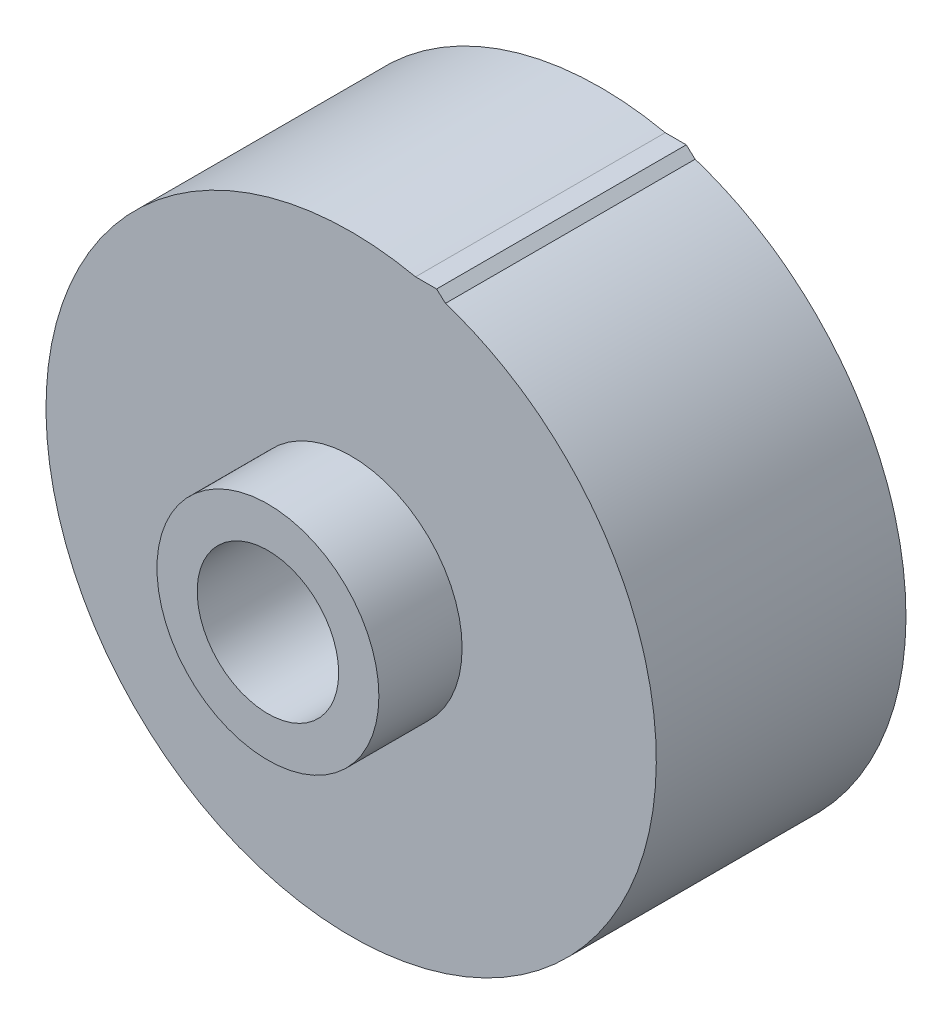
ISO-10303-21;
HEADER;
FILE_DESCRIPTION(('STEP AP214'),'2;1');
FILE_NAME('part.step','',(''),(''),'','','');
FILE_SCHEMA(('AUTOMOTIVE_DESIGN { 1 0 10303 214 1 1 1 1 }'));
ENDSEC;
DATA;
#1=APPLICATION_CONTEXT('core data for automotive mechanical design processes');
#2=APPLICATION_PROTOCOL_DEFINITION('international standard','automotive_design',2000,#1);
#3=PRODUCT_CONTEXT('',#1,'mechanical');
#4=PRODUCT('Part','Part','',(#3));
#5=PRODUCT_RELATED_PRODUCT_CATEGORY('part','',(#4));
#6=PRODUCT_DEFINITION_FORMATION('','',#4);
#7=PRODUCT_DEFINITION_CONTEXT('part definition',#1,'design');
#8=PRODUCT_DEFINITION('design','',#6,#7);
#9=PRODUCT_DEFINITION_SHAPE('','',#8);
#10=(LENGTH_UNIT() NAMED_UNIT(*) SI_UNIT(.MILLI.,.METRE.));
#11=(NAMED_UNIT(*) PLANE_ANGLE_UNIT() SI_UNIT($,.RADIAN.));
#12=(NAMED_UNIT(*) SI_UNIT($,.STERADIAN.) SOLID_ANGLE_UNIT());
#13=UNCERTAINTY_MEASURE_WITH_UNIT(LENGTH_MEASURE(1.E-05),#10,'distance_accuracy_value','');
#14=(GEOMETRIC_REPRESENTATION_CONTEXT(3) GLOBAL_UNCERTAINTY_ASSIGNED_CONTEXT((#13)) GLOBAL_UNIT_ASSIGNED_CONTEXT((#10,
#11,#12)) REPRESENTATION_CONTEXT('',''));
#15=CARTESIAN_POINT('',(0.,0.,0.));
#16=DIRECTION('',(0.,0.,1.));
#17=DIRECTION('',(1.,0.,0.));
#18=AXIS2_PLACEMENT_3D('',#15,#16,#17);
#19=CARTESIAN_POINT('',(0.,0.,18.));
#20=DIRECTION('',(0.,0.,-1.));
#21=DIRECTION('',(-1.,0.,0.));
#22=AXIS2_PLACEMENT_3D('',#19,#20,#21);
#23=CYLINDRICAL_SURFACE('',#22,22.);
#24=CARTESIAN_POINT('',(0.,0.,0.));
#25=DIRECTION('',(0.,0.,1.));
#26=DIRECTION('',(1.,0.,0.));
#27=AXIS2_PLACEMENT_3D('',#24,#25,#26);
#28=CIRCLE('',#27,22.);
#29=CARTESIAN_POINT('',(12.1073705117591,18.3687664063482,0.));
#30=VERTEX_POINT('',#29);
#31=CARTESIAN_POINT('',(7.74411035758695,20.5919584976639,0.));
#32=VERTEX_POINT('',#31);
#33=EDGE_CURVE('E246',#30,#32,#28,.T.);
#34=ORIENTED_EDGE('',*,*,#33,.T.);
#35=CARTESIAN_POINT('',(0.,0.,0.));
#36=DIRECTION('',(0.,0.,1.));
#37=DIRECTION('',(0.352005016253952,0.93599811353018,0.));
#38=AXIS2_PLACEMENT_3D('',#35,#36,#37);
#39=CIRCLE('',#38,22.);
#40=CARTESIAN_POINT('',(7.27312857975128,20.7629863136882,0.));
#41=VERTEX_POINT('',#40);
#42=EDGE_CURVE('E52',#32,#41,#39,.T.);
#43=ORIENTED_EDGE('',*,*,#42,.T.);
#44=CARTESIAN_POINT('',(0.,0.,0.));
#45=DIRECTION('',(0.,0.,1.));
#46=DIRECTION('',(0.330596753625059,0.943772105167647,0.));
#47=AXIS2_PLACEMENT_3D('',#44,#45,#46);
#48=CIRCLE('',#47,22.);
#49=CARTESIAN_POINT('',(6.79837387624923,20.9232433584932,0.));
#50=VERTEX_POINT('',#49);
#51=EDGE_CURVE('E11',#41,#50,#48,.T.);
#52=ORIENTED_EDGE('',*,*,#51,.T.);
#53=DIRECTION('',(0.,0.,-1.));
#54=VECTOR('',#53,1.);
#55=CARTESIAN_POINT('',(6.79837387624887,20.9232433584934,18.));
#56=LINE('',#55,#54);
#57=CARTESIAN_POINT('',(6.79837387624923,20.9232433584932,18.));
#58=VERTEX_POINT('',#57);
#59=EDGE_CURVE('E200',#58,#50,#56,.T.);
#60=ORIENTED_EDGE('',*,*,#59,.F.);
#61=CARTESIAN_POINT('',(7.27312857975088,20.7629863136884,18.));
#62=DIRECTION('',(-0.947475750444822,0.319827613440461,0.));
#63=VECTOR('',#62,1.);
#64=LINE('',#61,#63);
#65=CARTESIAN_POINT('',(7.27312857975126,20.7629863136882,18.));
#66=VERTEX_POINT('',#65);
#67=EDGE_CURVE('E188',#66,#58,#64,.T.);
#68=ORIENTED_EDGE('',*,*,#67,.F.);
#69=CARTESIAN_POINT('',(7.74411035758685,20.591958497664,18.));
#70=DIRECTION('',(-0.939946060794457,0.341323018264198,0.));
#71=VECTOR('',#70,1.);
#72=LINE('',#69,#71);
#73=CARTESIAN_POINT('',(7.74411035758685,20.591958497664,18.));
#74=VERTEX_POINT('',#73);
#75=EDGE_CURVE('E357',#74,#66,#72,.T.);
#76=ORIENTED_EDGE('',*,*,#75,.F.);
#77=CARTESIAN_POINT('',(0.,0.,18.));
#78=DIRECTION('',(0.,0.,1.));
#79=DIRECTION('',(1.,0.,0.));
#80=AXIS2_PLACEMENT_3D('',#77,#78,#79);
#81=CIRCLE('',#80,22.);
#82=CARTESIAN_POINT('',(12.1073705117591,18.3687664063482,18.));
#83=VERTEX_POINT('',#82);
#84=EDGE_CURVE('E238',#83,#74,#81,.T.);
#85=ORIENTED_EDGE('',*,*,#84,.F.);
#86=CARTESIAN_POINT('',(12.5225710645436,18.0882617720293,18.));
#87=DIRECTION('',(-0.828622554832474,0.559807700574853,0.));
#88=VECTOR('',#87,1.);
#89=LINE('',#86,#88);
#90=CARTESIAN_POINT('',(12.5225710645436,18.0882617720292,18.));
#91=VERTEX_POINT('',#90);
#92=EDGE_CURVE('E252',#91,#83,#89,.T.);
#93=ORIENTED_EDGE('',*,*,#92,.F.);
#94=CARTESIAN_POINT('',(12.9312755504344,17.7983738762489,18.));
#95=DIRECTION('',(-0.815658247559926,0.578534029411815,0.));
#96=VECTOR('',#95,1.);
#97=LINE('',#94,#96);
#98=CARTESIAN_POINT('',(12.9312755504344,17.7983738762488,18.));
#99=VERTEX_POINT('',#98);
#100=EDGE_CURVE('E633',#99,#91,#97,.T.);
#101=ORIENTED_EDGE('',*,*,#100,.F.);
#102=CARTESIAN_POINT('',(13.3332719545291,17.499253097963,18.));
#103=DIRECTION('',(-0.8022708186687,0.596960244499292,0.));
#104=VECTOR('',#103,1.);
#105=LINE('',#102,#104);
#106=CARTESIAN_POINT('',(13.3332719545291,17.499253097963,18.));
#107=VERTEX_POINT('',#106);
#108=EDGE_CURVE('E529',#107,#99,#105,.T.);
#109=ORIENTED_EDGE('',*,*,#108,.F.);
#110=CARTESIAN_POINT('',(13.7283517417335,17.1910546056734,18.));
#111=DIRECTION('',(-0.788467212869543,0.615076787262968,0.));
#112=VECTOR('',#111,1.);
#113=LINE('',#110,#112);
#114=CARTESIAN_POINT('',(13.7283517417336,17.1910546056732,18.));
#115=VERTEX_POINT('',#114);
#116=EDGE_CURVE('E524',#115,#107,#113,.T.);
#117=ORIENTED_EDGE('',*,*,#116,.F.);
#118=CARTESIAN_POINT('',(17.1910546056736,13.7283517417332,18.));
#119=VERTEX_POINT('',#118);
#120=EDGE_CURVE('E234',#119,#115,#81,.T.);
#121=ORIENTED_EDGE('',*,*,#120,.F.);
#122=CARTESIAN_POINT('',(17.4992530979631,13.333271954529,18.));
#123=DIRECTION('',(-0.61507678726297,0.788467212869542,0.));
#124=VECTOR('',#123,1.);
#125=LINE('',#122,#124);
#126=CARTESIAN_POINT('',(17.4992530979631,13.333271954529,18.));
#127=VERTEX_POINT('',#126);
#128=EDGE_CURVE('E486',#127,#119,#125,.T.);
#129=ORIENTED_EDGE('',*,*,#128,.F.);
#130=CARTESIAN_POINT('',(17.7983738762484,12.931275550435,18.));
#131=DIRECTION('',(-0.596960244499285,0.802270818668705,0.));
#132=VECTOR('',#131,1.);
#133=LINE('',#130,#132);
#134=CARTESIAN_POINT('',(17.7983738762488,12.9312755504344,18.));
#135=VERTEX_POINT('',#134);
#136=EDGE_CURVE('E665',#135,#127,#133,.T.);
#137=ORIENTED_EDGE('',*,*,#136,.F.);
#138=CARTESIAN_POINT('',(18.0882617720292,12.5225710645436,18.));
#139=DIRECTION('',(-0.578534029411815,0.815658247559926,0.));
#140=VECTOR('',#139,1.);
#141=LINE('',#138,#140);
#142=CARTESIAN_POINT('',(18.0882617720294,12.5225710645434,18.));
#143=VERTEX_POINT('',#142);
#144=EDGE_CURVE('E612',#143,#135,#141,.T.);
#145=ORIENTED_EDGE('',*,*,#144,.F.);
#146=CARTESIAN_POINT('',(18.3687664063485,12.1073705117587,18.));
#147=DIRECTION('',(-0.559807700574848,0.828622554832477,0.));
#148=VECTOR('',#147,1.);
#149=LINE('',#146,#148);
#150=CARTESIAN_POINT('',(18.3687664063484,12.1073705117588,18.));
#151=VERTEX_POINT('',#150);
#152=EDGE_CURVE('E611',#151,#143,#149,.T.);
#153=ORIENTED_EDGE('',*,*,#152,.F.);
#154=CARTESIAN_POINT('',(20.5919584976641,7.74411035758658,18.));
#155=VERTEX_POINT('',#154);
#156=EDGE_CURVE('E228',#155,#151,#81,.T.);
#157=ORIENTED_EDGE('',*,*,#156,.F.);
#158=CARTESIAN_POINT('',(20.7629863136884,7.27312857975075,18.));
#159=DIRECTION('',(-0.341323018264199,0.939946060794457,0.));
#160=VECTOR('',#159,1.);
#161=LINE('',#158,#160);
#162=CARTESIAN_POINT('',(20.7629863136884,7.27312857975074,18.));
#163=VERTEX_POINT('',#162);
#164=EDGE_CURVE('E507',#163,#155,#161,.T.);
#165=ORIENTED_EDGE('',*,*,#164,.F.);
#166=CARTESIAN_POINT('',(20.9232433584934,6.79837387624884,18.));
#167=DIRECTION('',(-0.31982761344046,0.947475750444823,0.));
#168=VECTOR('',#167,1.);
#169=LINE('',#166,#168);
#170=CARTESIAN_POINT('',(20.9232433584934,6.79837387624884,18.));
#171=VERTEX_POINT('',#170);
#172=EDGE_CURVE('E505',#171,#163,#169,.T.);
#173=ORIENTED_EDGE('',*,*,#172,.F.);
#174=CARTESIAN_POINT('',(21.072646498953,6.32009252544338,18.));
#175=DIRECTION('',(-0.298166298472499,0.954513938324218,0.));
#176=VECTOR('',#175,1.);
#177=LINE('',#174,#176);
#178=CARTESIAN_POINT('',(21.072646498953,6.32009252544338,18.));
#179=VERTEX_POINT('',#178);
#180=EDGE_CURVE('E502',#179,#171,#177,.T.);
#181=ORIENTED_EDGE('',*,*,#180,.F.);
#182=CARTESIAN_POINT('',(21.2111182323887,5.83853263514267,18.));
#183=DIRECTION('',(-0.276350310138293,0.961056973382156,0.));
#184=VECTOR('',#183,1.);
#185=LINE('',#182,#184);
#186=CARTESIAN_POINT('',(21.2111182323887,5.83853263514267,18.));
#187=VERTEX_POINT('',#186);
#188=EDGE_CURVE('E499',#187,#179,#185,.T.);
#189=ORIENTED_EDGE('',*,*,#188,.F.);
#190=CARTESIAN_POINT('',(4.64428732340897,21.5041994795813,18.));
#191=VERTEX_POINT('',#190);
#192=EDGE_CURVE('E242',#191,#187,#81,.T.);
#193=ORIENTED_EDGE('',*,*,#192,.F.);
#194=DIRECTION('',(0.,0.,-1.));
#195=VECTOR('',#194,1.);
#196=CARTESIAN_POINT('',(4.64428732340897,21.5041994795813,18.));
#197=LINE('',#196,#195);
#198=CARTESIAN_POINT('',(4.64428732340897,21.5041994795813,0.));
#199=VERTEX_POINT('',#198);
#200=EDGE_CURVE('E201',#191,#199,#197,.T.);
#201=ORIENTED_EDGE('',*,*,#200,.T.);
#202=CARTESIAN_POINT('',(21.2111182323887,5.83853263514267,0.));
#203=VERTEX_POINT('',#202);
#204=EDGE_CURVE('E220',#199,#203,#28,.T.);
#205=ORIENTED_EDGE('',*,*,#204,.T.);
#206=CARTESIAN_POINT('',(0.,0.,0.));
#207=DIRECTION('',(0.,0.,1.));
#208=DIRECTION('',(0.964141737835852,0.26538784705194,0.));
#209=AXIS2_PLACEMENT_3D('',#206,#207,#208);
#210=CIRCLE('',#209,22.);
#211=CARTESIAN_POINT('',(21.072646498953,6.32009252544338,0.));
#212=VERTEX_POINT('',#211);
#213=EDGE_CURVE('E483',#203,#212,#210,.T.);
#214=ORIENTED_EDGE('',*,*,#213,.T.);
#215=CARTESIAN_POINT('',(0.,0.,0.));
#216=DIRECTION('',(0.,0.,1.));
#217=DIRECTION('',(0.957847568134226,0.287276932974699,0.));
#218=AXIS2_PLACEMENT_3D('',#215,#216,#217);
#219=CIRCLE('',#218,22.);
#220=CARTESIAN_POINT('',(20.9232433584933,6.79837387624917,0.));
#221=VERTEX_POINT('',#220);
#222=EDGE_CURVE('E485',#212,#221,#219,.T.);
#223=ORIENTED_EDGE('',*,*,#222,.T.);
#224=CARTESIAN_POINT('',(0.,0.,0.));
#225=DIRECTION('',(0.,0.,1.));
#226=DIRECTION('',(0.951056516295149,0.309016994374962,0.));
#227=AXIS2_PLACEMENT_3D('',#224,#225,#226);
#228=CIRCLE('',#227,22.);
#229=CARTESIAN_POINT('',(20.7629863136884,7.27312857975074,0.));
#230=VERTEX_POINT('',#229);
#231=EDGE_CURVE('E497',#221,#230,#228,.T.);
#232=ORIENTED_EDGE('',*,*,#231,.T.);
#233=CARTESIAN_POINT('',(0.,0.,0.));
#234=DIRECTION('',(0.,0.,1.));
#235=DIRECTION('',(0.943772105167656,0.330596753625034,0.));
#236=AXIS2_PLACEMENT_3D('',#233,#234,#235);
#237=CIRCLE('',#236,22.);
#238=CARTESIAN_POINT('',(20.5919584976641,7.74411035758658,0.));
#239=VERTEX_POINT('',#238);
#240=EDGE_CURVE('E498',#230,#239,#237,.T.);
#241=ORIENTED_EDGE('',*,*,#240,.T.);
#242=CARTESIAN_POINT('',(18.3687664063484,12.1073705117588,0.));
#243=VERTEX_POINT('',#242);
#244=EDGE_CURVE('E479',#239,#243,#28,.T.);
#245=ORIENTED_EDGE('',*,*,#244,.T.);
#246=CARTESIAN_POINT('',(0.,0.,0.));
#247=DIRECTION('',(0.,0.,1.));
#248=DIRECTION('',(0.834943927561292,0.550335023261762,0.));
#249=AXIS2_PLACEMENT_3D('',#246,#247,#248);
#250=CIRCLE('',#249,22.);
#251=CARTESIAN_POINT('',(18.0882617720294,12.5225710645434,0.));
#252=VERTEX_POINT('',#251);
#253=EDGE_CURVE('E632',#243,#252,#250,.T.);
#254=ORIENTED_EDGE('',*,*,#253,.T.);
#255=CARTESIAN_POINT('',(0.,0.,0.));
#256=DIRECTION('',(0.,0.,1.));
#257=DIRECTION('',(0.822193716910428,0.569207775661063,0.));
#258=AXIS2_PLACEMENT_3D('',#255,#256,#257);
#259=CIRCLE('',#258,22.);
#260=CARTESIAN_POINT('',(17.7983738762489,12.9312755504344,0.));
#261=VERTEX_POINT('',#260);
#262=EDGE_CURVE('E623',#252,#261,#259,.T.);
#263=ORIENTED_EDGE('',*,*,#262,.T.);
#264=CARTESIAN_POINT('',(0.,0.,0.));
#265=DIRECTION('',(0.,0.,1.));
#266=DIRECTION('',(0.809016994374949,0.587785252292471,0.));
#267=AXIS2_PLACEMENT_3D('',#264,#265,#266);
#268=CIRCLE('',#267,22.);
#269=CARTESIAN_POINT('',(17.4992530979631,13.333271954529,0.));
#270=VERTEX_POINT('',#269);
#271=EDGE_CURVE('E621',#261,#270,#268,.T.);
#272=ORIENTED_EDGE('',*,*,#271,.T.);
#273=CARTESIAN_POINT('',(0.,0.,0.));
#274=DIRECTION('',(0.,0.,1.));
#275=DIRECTION('',(0.795420595361959,0.606057816114953,0.));
#276=AXIS2_PLACEMENT_3D('',#273,#274,#275);
#277=CIRCLE('',#276,22.);
#278=CARTESIAN_POINT('',(17.1910546056736,13.7283517417332,0.));
#279=VERTEX_POINT('',#278);
#280=EDGE_CURVE('E568',#270,#279,#277,.T.);
#281=ORIENTED_EDGE('',*,*,#280,.T.);
#282=CARTESIAN_POINT('',(13.7283517417336,17.1910546056732,0.));
#283=VERTEX_POINT('',#282);
#284=EDGE_CURVE('E249',#279,#283,#28,.T.);
#285=ORIENTED_EDGE('',*,*,#284,.T.);
#286=CARTESIAN_POINT('',(0.,0.,0.));
#287=DIRECTION('',(0.,0.,1.));
#288=DIRECTION('',(0.624015988260619,0.781411572985148,0.));
#289=AXIS2_PLACEMENT_3D('',#286,#287,#288);
#290=CIRCLE('',#289,22.);
#291=CARTESIAN_POINT('',(13.3332719545291,17.499253097963,0.));
#292=VERTEX_POINT('',#291);
#293=EDGE_CURVE('E471',#283,#292,#290,.T.);
#294=ORIENTED_EDGE('',*,*,#293,.T.);
#295=CARTESIAN_POINT('',(0.,0.,0.));
#296=DIRECTION('',(0.,0.,1.));
#297=DIRECTION('',(0.606057816114959,0.795420595361955,0.));
#298=AXIS2_PLACEMENT_3D('',#295,#296,#297);
#299=CIRCLE('',#298,22.);
#300=CARTESIAN_POINT('',(12.9312755504346,17.7983738762487,0.));
#301=VERTEX_POINT('',#300);
#302=EDGE_CURVE('E542',#292,#301,#299,.T.);
#303=ORIENTED_EDGE('',*,*,#302,.T.);
#304=CARTESIAN_POINT('',(0.,0.,0.));
#305=DIRECTION('',(0.,0.,1.));
#306=DIRECTION('',(0.587785252292481,0.809016994374942,0.));
#307=AXIS2_PLACEMENT_3D('',#304,#305,#306);
#308=CIRCLE('',#307,22.);
#309=CARTESIAN_POINT('',(12.5225710645436,18.0882617720292,0.));
#310=VERTEX_POINT('',#309);
#311=EDGE_CURVE('E541',#301,#310,#308,.T.);
#312=ORIENTED_EDGE('',*,*,#311,.T.);
#313=CARTESIAN_POINT('',(0.,0.,0.));
#314=DIRECTION('',(0.,0.,1.));
#315=DIRECTION('',(0.569207775661075,0.82219371691042,0.));
#316=AXIS2_PLACEMENT_3D('',#313,#314,#315);
#317=CIRCLE('',#316,22.);
#318=EDGE_CURVE('E530',#310,#30,#317,.T.);
#319=ORIENTED_EDGE('',*,*,#318,.T.);
#320=EDGE_LOOP('',(#34,#43,#52,#60,#68,#76,#85,#93,#101,#109,#117,#121,#129,#137,#145,#153,#157,
#165,#173,#181,#189,#193,#201,#205,#214,#223,#232,#241,#245,#254,#263,#272,#281,#285,#294,#303,
#312,#319));
#321=FACE_BOUND('',#320,.T.);
#322=ADVANCED_FACE('F41',(#321),#23,.T.);
#323=CARTESIAN_POINT('',(0.,0.,24.));
#324=DIRECTION('',(0.,0.,1.));
#325=DIRECTION('',(1.,0.,0.));
#326=AXIS2_PLACEMENT_3D('',#323,#324,#325);
#327=PLANE('',#326);
#328=CARTESIAN_POINT('',(0.,0.,24.));
#329=DIRECTION('',(0.,0.,1.));
#330=DIRECTION('',(1.,0.,0.));
#331=AXIS2_PLACEMENT_3D('',#328,#329,#330);
#332=CIRCLE('',#331,8.);
#333=CARTESIAN_POINT('',(8.,0.,24.));
#334=VERTEX_POINT('',#333);
#335=EDGE_CURVE('E509',#334,#334,#332,.T.);
#336=ORIENTED_EDGE('',*,*,#335,.T.);
#337=EDGE_LOOP('',(#336));
#338=FACE_BOUND('',#337,.T.);
#339=CARTESIAN_POINT('',(0.,0.,24.));
#340=DIRECTION('',(0.,0.,1.));
#341=DIRECTION('',(1.,0.,0.));
#342=AXIS2_PLACEMENT_3D('',#339,#340,#341);
#343=CIRCLE('',#342,5.1);
#344=CARTESIAN_POINT('',(5.1,0.,24.));
#345=VERTEX_POINT('',#344);
#346=EDGE_CURVE('E513',#345,#345,#343,.T.);
#347=ORIENTED_EDGE('',*,*,#346,.F.);
#348=EDGE_LOOP('',(#347));
#349=FACE_BOUND('',#348,.T.);
#350=ADVANCED_FACE('F387',(#338,#349),#327,.T.);
#351=CARTESIAN_POINT('',(0.,0.,0.));
#352=DIRECTION('',(0.,0.,1.));
#353=DIRECTION('',(1.,0.,0.));
#354=AXIS2_PLACEMENT_3D('',#351,#352,#353);
#355=PLANE('',#354);
#356=ORIENTED_EDGE('',*,*,#42,.F.);
#357=ORIENTED_EDGE('',*,*,#33,.F.);
#358=ORIENTED_EDGE('',*,*,#318,.F.);
#359=ORIENTED_EDGE('',*,*,#311,.F.);
#360=ORIENTED_EDGE('',*,*,#302,.F.);
#361=ORIENTED_EDGE('',*,*,#293,.F.);
#362=ORIENTED_EDGE('',*,*,#284,.F.);
#363=ORIENTED_EDGE('',*,*,#280,.F.);
#364=ORIENTED_EDGE('',*,*,#271,.F.);
#365=ORIENTED_EDGE('',*,*,#262,.F.);
#366=ORIENTED_EDGE('',*,*,#253,.F.);
#367=ORIENTED_EDGE('',*,*,#244,.F.);
#368=ORIENTED_EDGE('',*,*,#240,.F.);
#369=ORIENTED_EDGE('',*,*,#231,.F.);
#370=ORIENTED_EDGE('',*,*,#222,.F.);
#371=ORIENTED_EDGE('',*,*,#213,.F.);
#372=ORIENTED_EDGE('',*,*,#204,.F.);
#373=DIRECTION('',(-1.,0.,0.));
#374=VECTOR('',#373,1.);
#375=CARTESIAN_POINT('',(4.64428732340897,21.5041994795813,0.));
#376=LINE('',#375,#374);
#377=CARTESIAN_POINT('',(6.16008778444417,21.5041994795813,0.));
#378=VERTEX_POINT('',#377);
#379=EDGE_CURVE('E191',#378,#199,#376,.T.);
#380=ORIENTED_EDGE('',*,*,#379,.F.);
#381=DIRECTION('',(-0.739538540553893,0.67311421544595,0.));
#382=VECTOR('',#381,1.);
#383=CARTESIAN_POINT('',(6.16008778444417,21.5041994795813,0.));
#384=LINE('',#383,#382);
#385=EDGE_CURVE('E196',#50,#378,#384,.T.);
#386=ORIENTED_EDGE('',*,*,#385,.F.);
#387=ORIENTED_EDGE('',*,*,#51,.F.);
#388=EDGE_LOOP('',(#356,#357,#358,#359,#360,#361,#362,#363,#364,#365,#366,#367,#368,#369,#370,
#371,#372,#380,#386,#387));
#389=FACE_BOUND('',#388,.T.);
#390=CARTESIAN_POINT('',(0.,0.,0.));
#391=DIRECTION('',(0.,0.,1.));
#392=DIRECTION('',(1.,0.,0.));
#393=AXIS2_PLACEMENT_3D('',#390,#391,#392);
#394=CIRCLE('',#393,5.1);
#395=CARTESIAN_POINT('',(5.1,0.,0.));
#396=VERTEX_POINT('',#395);
#397=EDGE_CURVE('E518',#396,#396,#394,.T.);
#398=ORIENTED_EDGE('',*,*,#397,.T.);
#399=EDGE_LOOP('',(#398));
#400=FACE_BOUND('',#399,.T.);
#401=ADVANCED_FACE('F378',(#389,#400),#355,.F.);
#402=CARTESIAN_POINT('',(0.,0.,24.));
#403=DIRECTION('',(0.,0.,-1.));
#404=DIRECTION('',(-1.,0.,0.));
#405=AXIS2_PLACEMENT_3D('',#402,#403,#404);
#406=CYLINDRICAL_SURFACE('',#405,8.);
#407=CARTESIAN_POINT('',(0.,0.,18.));
#408=DIRECTION('',(0.,0.,1.));
#409=DIRECTION('',(1.,0.,0.));
#410=AXIS2_PLACEMENT_3D('',#407,#408,#409);
#411=CIRCLE('',#410,8.);
#412=CARTESIAN_POINT('',(8.,0.,18.));
#413=VERTEX_POINT('',#412);
#414=EDGE_CURVE('E210',#413,#413,#411,.T.);
#415=ORIENTED_EDGE('',*,*,#414,.T.);
#416=EDGE_LOOP('',(#415));
#417=FACE_BOUND('',#416,.T.);
#418=ORIENTED_EDGE('',*,*,#335,.F.);
#419=EDGE_LOOP('',(#418));
#420=FACE_BOUND('',#419,.T.);
#421=ADVANCED_FACE('F43',(#417,#420),#406,.T.);
#422=CARTESIAN_POINT('',(0.,0.,24.));
#423=DIRECTION('',(0.,0.,-1.));
#424=DIRECTION('',(-1.,0.,0.));
#425=AXIS2_PLACEMENT_3D('',#422,#423,#424);
#426=CYLINDRICAL_SURFACE('',#425,5.1);
#427=ORIENTED_EDGE('',*,*,#346,.T.);
#428=EDGE_LOOP('',(#427));
#429=FACE_BOUND('',#428,.T.);
#430=ORIENTED_EDGE('',*,*,#397,.F.);
#431=EDGE_LOOP('',(#430));
#432=FACE_BOUND('',#431,.T.);
#433=ADVANCED_FACE('F267',(#429,#432),#426,.F.);
#434=CARTESIAN_POINT('',(0.,0.,18.));
#435=DIRECTION('',(0.,0.,1.));
#436=DIRECTION('',(1.,0.,0.));
#437=AXIS2_PLACEMENT_3D('',#434,#435,#436);
#438=PLANE('',#437);
#439=ORIENTED_EDGE('',*,*,#67,.T.);
#440=DIRECTION('',(-0.739538540553893,0.67311421544595,0.));
#441=VECTOR('',#440,1.);
#442=CARTESIAN_POINT('',(6.16008778444417,21.5041994795813,18.));
#443=LINE('',#442,#441);
#444=CARTESIAN_POINT('',(6.16008778444417,21.5041994795813,18.));
#445=VERTEX_POINT('',#444);
#446=EDGE_CURVE('E180',#58,#445,#443,.T.);
#447=ORIENTED_EDGE('',*,*,#446,.T.);
#448=DIRECTION('',(-1.,0.,0.));
#449=VECTOR('',#448,1.);
#450=CARTESIAN_POINT('',(4.64428732340897,21.5041994795813,18.));
#451=LINE('',#450,#449);
#452=EDGE_CURVE('E185',#445,#191,#451,.T.);
#453=ORIENTED_EDGE('',*,*,#452,.T.);
#454=ORIENTED_EDGE('',*,*,#192,.T.);
#455=ORIENTED_EDGE('',*,*,#188,.T.);
#456=ORIENTED_EDGE('',*,*,#180,.T.);
#457=ORIENTED_EDGE('',*,*,#172,.T.);
#458=ORIENTED_EDGE('',*,*,#164,.T.);
#459=ORIENTED_EDGE('',*,*,#156,.T.);
#460=ORIENTED_EDGE('',*,*,#152,.T.);
#461=ORIENTED_EDGE('',*,*,#144,.T.);
#462=ORIENTED_EDGE('',*,*,#136,.T.);
#463=ORIENTED_EDGE('',*,*,#128,.T.);
#464=ORIENTED_EDGE('',*,*,#120,.T.);
#465=ORIENTED_EDGE('',*,*,#116,.T.);
#466=ORIENTED_EDGE('',*,*,#108,.T.);
#467=ORIENTED_EDGE('',*,*,#100,.T.);
#468=ORIENTED_EDGE('',*,*,#92,.T.);
#469=ORIENTED_EDGE('',*,*,#84,.T.);
#470=ORIENTED_EDGE('',*,*,#75,.T.);
#471=EDGE_LOOP('',(#439,#447,#453,#454,#455,#456,#457,#458,#459,#460,#461,#462,#463,#464,#465,
#466,#467,#468,#469,#470));
#472=FACE_BOUND('',#471,.T.);
#473=ORIENTED_EDGE('',*,*,#414,.F.);
#474=EDGE_LOOP('',(#473));
#475=FACE_BOUND('',#474,.T.);
#476=ADVANCED_FACE('F182',(#472,#475),#438,.T.);
#477=CARTESIAN_POINT('',(6.16008778444417,21.5041994795813,18.));
#478=DIRECTION('',(-0.67311421544595,-0.739538540553893,0.));
#479=DIRECTION('',(0.739538540553893,-0.67311421544595,0.));
#480=AXIS2_PLACEMENT_3D('',#477,#478,#479);
#481=PLANE('',#480);
#482=ORIENTED_EDGE('',*,*,#385,.T.);
#483=DIRECTION('',(0.,0.,-1.));
#484=VECTOR('',#483,1.);
#485=CARTESIAN_POINT('',(6.16008778444417,21.5041994795813,18.));
#486=LINE('',#485,#484);
#487=EDGE_CURVE('E194',#445,#378,#486,.T.);
#488=ORIENTED_EDGE('',*,*,#487,.F.);
#489=ORIENTED_EDGE('',*,*,#446,.F.);
#490=ORIENTED_EDGE('',*,*,#59,.T.);
#491=EDGE_LOOP('',(#482,#488,#489,#490));
#492=FACE_BOUND('',#491,.T.);
#493=ADVANCED_FACE('F195',(#492),#481,.F.);
#494=CARTESIAN_POINT('',(4.64428732340897,21.5041994795813,18.));
#495=DIRECTION('',(0.,-1.,0.));
#496=DIRECTION('',(0.,0.,-1.));
#497=AXIS2_PLACEMENT_3D('',#494,#495,#496);
#498=PLANE('',#497);
#499=ORIENTED_EDGE('',*,*,#379,.T.);
#500=ORIENTED_EDGE('',*,*,#200,.F.);
#501=ORIENTED_EDGE('',*,*,#452,.F.);
#502=ORIENTED_EDGE('',*,*,#487,.T.);
#503=EDGE_LOOP('',(#499,#500,#501,#502));
#504=FACE_BOUND('',#503,.T.);
#505=ADVANCED_FACE('F203',(#504),#498,.F.);
#506=CLOSED_SHELL('',(#322,#350,#401,#421,#433,#476,#493,#505));
#507=MANIFOLD_SOLID_BREP('B2',#506);
#508=ADVANCED_BREP_SHAPE_REPRESENTATION('',(#18,#507),#14);
#509=SHAPE_DEFINITION_REPRESENTATION(#9,#508);
ENDSEC;
END-ISO-10303-21;
